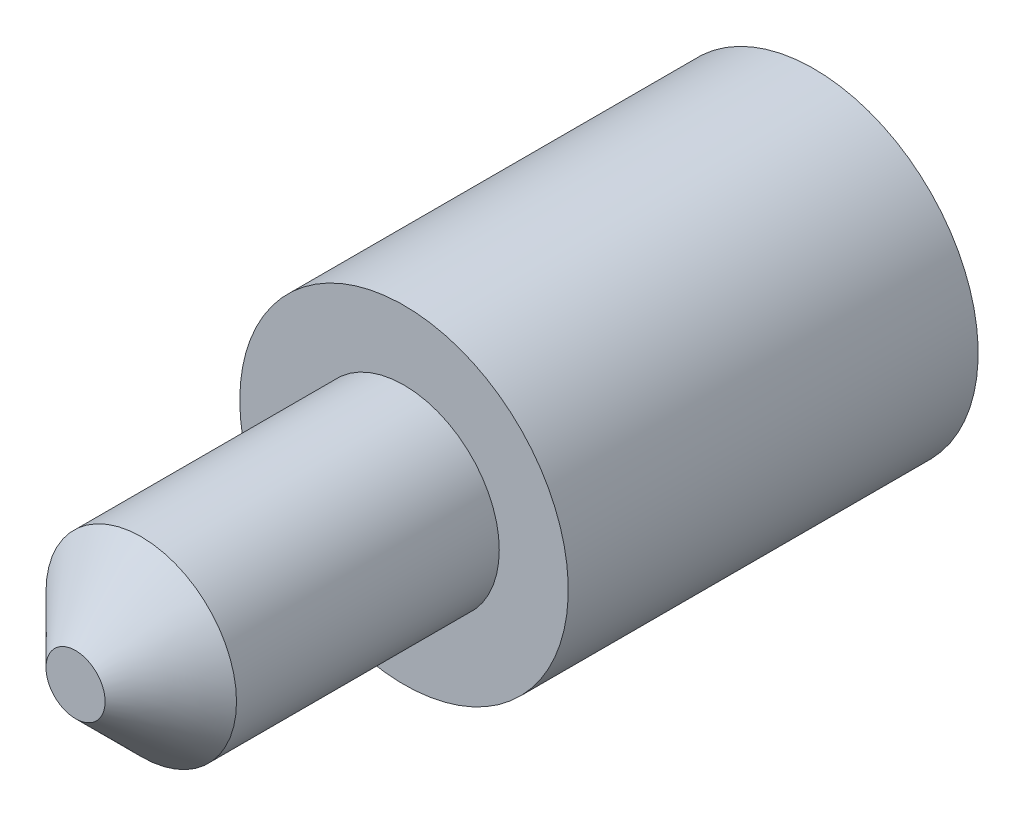
ISO-10303-21;
HEADER;
FILE_DESCRIPTION(('STEP AP214'),'2;1');
FILE_NAME('part.step','',(''),(''),'','','');
FILE_SCHEMA(('AUTOMOTIVE_DESIGN { 1 0 10303 214 1 1 1 1 }'));
ENDSEC;
DATA;
#1=APPLICATION_CONTEXT('core data for automotive mechanical design processes');
#2=APPLICATION_PROTOCOL_DEFINITION('international standard','automotive_design',2000,#1);
#3=PRODUCT_CONTEXT('',#1,'mechanical');
#4=PRODUCT('Part','Part','',(#3));
#5=PRODUCT_RELATED_PRODUCT_CATEGORY('part','',(#4));
#6=PRODUCT_DEFINITION_FORMATION('','',#4);
#7=PRODUCT_DEFINITION_CONTEXT('part definition',#1,'design');
#8=PRODUCT_DEFINITION('design','',#6,#7);
#9=PRODUCT_DEFINITION_SHAPE('','',#8);
#10=(LENGTH_UNIT() NAMED_UNIT(*) SI_UNIT(.MILLI.,.METRE.));
#11=(NAMED_UNIT(*) PLANE_ANGLE_UNIT() SI_UNIT($,.RADIAN.));
#12=(NAMED_UNIT(*) SI_UNIT($,.STERADIAN.) SOLID_ANGLE_UNIT());
#13=UNCERTAINTY_MEASURE_WITH_UNIT(LENGTH_MEASURE(1.E-05),#10,'distance_accuracy_value','');
#14=(GEOMETRIC_REPRESENTATION_CONTEXT(3) GLOBAL_UNCERTAINTY_ASSIGNED_CONTEXT((#13)) GLOBAL_UNIT_ASSIGNED_CONTEXT((#10,
#11,#12)) REPRESENTATION_CONTEXT('',''));
#15=CARTESIAN_POINT('',(0.,0.,0.));
#16=DIRECTION('',(0.,0.,1.));
#17=DIRECTION('',(1.,0.,0.));
#18=AXIS2_PLACEMENT_3D('',#15,#16,#17);
#19=CARTESIAN_POINT('',(0.,0.,6.24));
#20=DIRECTION('',(0.,0.,1.));
#21=DIRECTION('',(1.,0.,0.));
#22=AXIS2_PLACEMENT_3D('',#19,#20,#21);
#23=PLANE('',#22);
#24=CARTESIAN_POINT('',(0.,0.,6.24));
#25=DIRECTION('',(0.,0.,1.));
#26=DIRECTION('',(1.,0.,0.));
#27=AXIS2_PLACEMENT_3D('',#24,#25,#26);
#28=CIRCLE('',#27,2.5);
#29=CARTESIAN_POINT('',(-2.5,0.,6.24));
#30=VERTEX_POINT('',#29);
#31=EDGE_CURVE('E66',#30,#30,#28,.T.);
#32=ORIENTED_EDGE('',*,*,#31,.T.);
#33=EDGE_LOOP('',(#32));
#34=FACE_BOUND('',#33,.T.);
#35=CARTESIAN_POINT('',(0.,0.,6.24));
#36=DIRECTION('',(0.,0.,1.));
#37=DIRECTION('',(1.,0.,0.));
#38=AXIS2_PLACEMENT_3D('',#35,#36,#37);
#39=CIRCLE('',#38,1.45);
#40=CARTESIAN_POINT('',(1.45,0.,6.24));
#41=VERTEX_POINT('',#40);
#42=EDGE_CURVE('E57',#41,#41,#39,.T.);
#43=ORIENTED_EDGE('',*,*,#42,.F.);
#44=EDGE_LOOP('',(#43));
#45=FACE_BOUND('',#44,.T.);
#46=ADVANCED_FACE('F37',(#34,#45),#23,.T.);
#47=CARTESIAN_POINT('',(0.,0.,6.24));
#48=DIRECTION('',(0.,0.,-1.));
#49=DIRECTION('',(-1.,0.,0.));
#50=AXIS2_PLACEMENT_3D('',#47,#48,#49);
#51=CYLINDRICAL_SURFACE('',#50,2.5);
#52=CARTESIAN_POINT('',(0.,0.,0.));
#53=DIRECTION('',(0.,0.,1.));
#54=DIRECTION('',(1.,0.,0.));
#55=AXIS2_PLACEMENT_3D('',#52,#53,#54);
#56=CIRCLE('',#55,2.5);
#57=CARTESIAN_POINT('',(-2.5,0.,0.));
#58=VERTEX_POINT('',#57);
#59=EDGE_CURVE('E61',#58,#58,#56,.T.);
#60=CARTESIAN_POINT('',(-2.5,0.,6.24));
#61=CARTESIAN_POINT('',(-2.5,0.,6.175));
#62=CARTESIAN_POINT('',(-2.5,0.,6.11));
#63=CARTESIAN_POINT('',(-2.5,0.,5.98));
#64=CARTESIAN_POINT('',(-2.5,0.,5.915));
#65=CARTESIAN_POINT('',(-2.5,0.,5.785));
#66=CARTESIAN_POINT('',(-2.5,0.,5.72));
#67=CARTESIAN_POINT('',(-2.5,0.,5.59));
#68=CARTESIAN_POINT('',(-2.5,0.,5.525));
#69=CARTESIAN_POINT('',(-2.5,0.,5.395));
#70=CARTESIAN_POINT('',(-2.5,0.,5.33));
#71=CARTESIAN_POINT('',(-2.5,0.,5.2));
#72=CARTESIAN_POINT('',(-2.5,0.,5.135));
#73=CARTESIAN_POINT('',(-2.5,0.,5.005));
#74=CARTESIAN_POINT('',(-2.5,0.,4.94));
#75=CARTESIAN_POINT('',(-2.5,0.,4.81));
#76=CARTESIAN_POINT('',(-2.5,0.,4.745));
#77=CARTESIAN_POINT('',(-2.5,0.,4.615));
#78=CARTESIAN_POINT('',(-2.5,0.,4.55));
#79=CARTESIAN_POINT('',(-2.5,0.,4.42));
#80=CARTESIAN_POINT('',(-2.5,0.,4.355));
#81=CARTESIAN_POINT('',(-2.5,0.,4.225));
#82=CARTESIAN_POINT('',(-2.5,0.,4.16));
#83=CARTESIAN_POINT('',(-2.5,0.,4.03));
#84=CARTESIAN_POINT('',(-2.5,0.,3.965));
#85=CARTESIAN_POINT('',(-2.5,0.,3.835));
#86=CARTESIAN_POINT('',(-2.5,0.,3.77));
#87=CARTESIAN_POINT('',(-2.5,0.,3.64));
#88=CARTESIAN_POINT('',(-2.5,0.,3.575));
#89=CARTESIAN_POINT('',(-2.5,0.,3.445));
#90=CARTESIAN_POINT('',(-2.5,0.,3.38));
#91=CARTESIAN_POINT('',(-2.5,0.,3.25));
#92=CARTESIAN_POINT('',(-2.5,0.,3.185));
#93=CARTESIAN_POINT('',(-2.5,0.,3.055));
#94=CARTESIAN_POINT('',(-2.5,0.,2.99));
#95=CARTESIAN_POINT('',(-2.5,0.,2.86));
#96=CARTESIAN_POINT('',(-2.5,0.,2.795));
#97=CARTESIAN_POINT('',(-2.5,0.,2.665));
#98=CARTESIAN_POINT('',(-2.5,0.,2.6));
#99=CARTESIAN_POINT('',(-2.5,0.,2.47));
#100=CARTESIAN_POINT('',(-2.5,0.,2.405));
#101=CARTESIAN_POINT('',(-2.5,0.,2.275));
#102=CARTESIAN_POINT('',(-2.5,0.,2.21));
#103=CARTESIAN_POINT('',(-2.5,0.,2.08));
#104=CARTESIAN_POINT('',(-2.5,0.,2.015));
#105=CARTESIAN_POINT('',(-2.5,0.,1.885));
#106=CARTESIAN_POINT('',(-2.5,0.,1.82));
#107=CARTESIAN_POINT('',(-2.5,0.,1.69));
#108=CARTESIAN_POINT('',(-2.5,0.,1.625));
#109=CARTESIAN_POINT('',(-2.5,0.,1.495));
#110=CARTESIAN_POINT('',(-2.5,0.,1.43));
#111=CARTESIAN_POINT('',(-2.5,0.,1.3));
#112=CARTESIAN_POINT('',(-2.5,0.,1.235));
#113=CARTESIAN_POINT('',(-2.5,0.,1.105));
#114=CARTESIAN_POINT('',(-2.5,0.,1.04));
#115=CARTESIAN_POINT('',(-2.5,0.,0.91));
#116=CARTESIAN_POINT('',(-2.5,0.,0.845));
#117=CARTESIAN_POINT('',(-2.5,0.,0.715));
#118=CARTESIAN_POINT('',(-2.5,0.,0.65));
#119=CARTESIAN_POINT('',(-2.5,0.,0.52));
#120=CARTESIAN_POINT('',(-2.5,0.,0.455));
#121=CARTESIAN_POINT('',(-2.5,0.,0.325));
#122=CARTESIAN_POINT('',(-2.5,0.,0.26));
#123=CARTESIAN_POINT('',(-2.5,0.,0.13));
#124=CARTESIAN_POINT('',(-2.5,0.,0.0649999999999999));
#125=CARTESIAN_POINT('',(-2.5,0.,0.));
#126=B_SPLINE_CURVE_WITH_KNOTS('',3,(#60,#61,#62,#63,#64,#65,#66,#67,#68,#69,#70,#71,#72,#73,
#74,#75,#76,#77,#78,#79,#80,#81,#82,#83,#84,#85,#86,#87,#88,#89,#90,#91,#92,#93,#94,#95,#96,#97,
#98,#99,#100,#101,#102,#103,#104,#105,#106,#107,#108,#109,#110,#111,#112,#113,#114,#115,#116,
#117,#118,#119,#120,#121,#122,#123,#124,#125),.UNSPECIFIED.,.F.,.F.,(4,2,2,2,2,2,2,2,2,2,2,2,2,
2,2,2,2,2,2,2,2,2,2,2,2,2,2,2,2,2,2,2,4),(0.,0.195000000000001,0.390000000000001,0.585,0.78,
0.975,1.17,1.365,1.56,1.755,1.95,2.145,2.34,2.535,2.73,2.925,3.12,3.315,3.51,3.705,3.9,4.095,
4.29,4.485,4.68,4.875,5.07,5.265,5.46,5.655,5.85,6.045,6.24),.UNSPECIFIED.);
#127=EDGE_CURVE('BSEAM82',#30,#58,#126,.T.);
#128=ORIENTED_EDGE('',*,*,#31,.F.);
#129=ORIENTED_EDGE('',*,*,#59,.T.);
#130=ORIENTED_EDGE('',*,*,#127,.T.);
#131=ORIENTED_EDGE('',*,*,#127,.F.);
#132=EDGE_LOOP('',(#128,#130,#129,#131));
#133=FACE_BOUND('',#132,.T.);
#134=ADVANCED_FACE('F82',(#133),#51,.T.);
#135=CARTESIAN_POINT('',(0.,0.,0.));
#136=DIRECTION('',(0.,0.,1.));
#137=DIRECTION('',(1.,0.,0.));
#138=AXIS2_PLACEMENT_3D('',#135,#136,#137);
#139=PLANE('',#138);
#140=CARTESIAN_POINT('',(0.,0.,0.));
#141=DIRECTION('',(0.,0.,-1.));
#142=DIRECTION('',(-1.,0.,0.));
#143=AXIS2_PLACEMENT_3D('',#140,#141,#142);
#144=CIRCLE('',#143,1.24999999999999);
#145=CARTESIAN_POINT('',(-1.24999999999999,0.,0.));
#146=VERTEX_POINT('',#145);
#147=EDGE_CURVE('E58',#146,#146,#144,.T.);
#148=ORIENTED_EDGE('',*,*,#147,.F.);
#149=EDGE_LOOP('',(#148));
#150=FACE_BOUND('',#149,.T.);
#151=ORIENTED_EDGE('',*,*,#59,.F.);
#152=EDGE_LOOP('',(#151));
#153=FACE_BOUND('',#152,.T.);
#154=ADVANCED_FACE('F88',(#150,#153),#139,.F.);
#155=CARTESIAN_POINT('',(0.,0.,11.24));
#156=DIRECTION('',(0.,0.,-1.));
#157=DIRECTION('',(-1.,0.,0.));
#158=AXIS2_PLACEMENT_3D('',#155,#156,#157);
#159=CYLINDRICAL_SURFACE('',#158,1.45);
#160=CARTESIAN_POINT('',(0.,0.,10.24));
#161=DIRECTION('',(0.,0.,1.));
#162=DIRECTION('',(1.,0.,0.));
#163=AXIS2_PLACEMENT_3D('',#160,#161,#162);
#164=CIRCLE('',#163,1.45);
#165=CARTESIAN_POINT('',(-1.45,0.,10.24));
#166=VERTEX_POINT('',#165);
#167=EDGE_CURVE('E11',#166,#166,#164,.F.);
#168=ORIENTED_EDGE('',*,*,#167,.T.);
#169=EDGE_LOOP('',(#168));
#170=FACE_BOUND('',#169,.T.);
#171=ORIENTED_EDGE('',*,*,#42,.T.);
#172=EDGE_LOOP('',(#171));
#173=FACE_BOUND('',#172,.T.);
#174=ADVANCED_FACE('F93',(#170,#173),#159,.T.);
#175=CARTESIAN_POINT('',(0.,0.,11.24));
#176=DIRECTION('',(0.,0.,1.));
#177=DIRECTION('',(1.,0.,0.));
#178=AXIS2_PLACEMENT_3D('',#175,#176,#177);
#179=PLANE('',#178);
#180=CARTESIAN_POINT('',(0.,0.,11.24));
#181=DIRECTION('',(0.,0.,1.));
#182=DIRECTION('',(1.,0.,0.));
#183=AXIS2_PLACEMENT_3D('',#180,#181,#182);
#184=CIRCLE('',#183,0.449999999999999);
#185=CARTESIAN_POINT('',(-0.45,0.,11.24));
#186=VERTEX_POINT('',#185);
#187=EDGE_CURVE('E44',#186,#186,#184,.T.);
#188=ORIENTED_EDGE('',*,*,#187,.T.);
#189=EDGE_LOOP('',(#188));
#190=FACE_BOUND('',#189,.T.);
#191=ADVANCED_FACE('F51',(#190),#179,.T.);
#192=CARTESIAN_POINT('',(0.,0.,5.));
#193=DIRECTION('',(0.,0.,-1.));
#194=DIRECTION('',(-1.,0.,0.));
#195=AXIS2_PLACEMENT_3D('',#192,#193,#194);
#196=CONICAL_SURFACE('',#195,1.25,1.02974425867665);
#197=CARTESIAN_POINT('',(0.,0.,5.75107577378445));
#198=VERTEX_POINT('',#197);
#199=VERTEX_LOOP('',#198);
#200=FACE_BOUND('',#199,.T.);
#201=CARTESIAN_POINT('',(0.,0.,5.));
#202=DIRECTION('',(0.,0.,-1.));
#203=DIRECTION('',(-1.,0.,0.));
#204=AXIS2_PLACEMENT_3D('',#201,#202,#203);
#205=CIRCLE('',#204,1.25);
#206=CARTESIAN_POINT('',(-1.25,0.,5.));
#207=VERTEX_POINT('',#206);
#208=EDGE_CURVE('E55',#207,#207,#205,.T.);
#209=ORIENTED_EDGE('',*,*,#208,.T.);
#210=EDGE_LOOP('',(#209));
#211=FACE_BOUND('',#210,.T.);
#212=ADVANCED_FACE('F47',(#200,#211),#196,.F.);
#213=CARTESIAN_POINT('',(0.,0.,0.));
#214=DIRECTION('',(0.,0.,-1.));
#215=DIRECTION('',(-1.,0.,0.));
#216=AXIS2_PLACEMENT_3D('',#213,#214,#215);
#217=CYLINDRICAL_SURFACE('',#216,1.24999999999999);
#218=ORIENTED_EDGE('',*,*,#208,.F.);
#219=EDGE_LOOP('',(#218));
#220=FACE_BOUND('',#219,.T.);
#221=ORIENTED_EDGE('',*,*,#147,.T.);
#222=EDGE_LOOP('',(#221));
#223=FACE_BOUND('',#222,.T.);
#224=ADVANCED_FACE('F50',(#220,#223),#217,.F.);
#225=CARTESIAN_POINT('',(0.,0.,11.24));
#226=DIRECTION('',(0.,0.,-1.));
#227=DIRECTION('',(-1.,0.,0.));
#228=AXIS2_PLACEMENT_3D('',#225,#226,#227);
#229=CONICAL_SURFACE('',#228,0.449999999999999,0.785398163397447);
#230=CARTESIAN_POINT('',(-1.45,0.,10.24));
#231=CARTESIAN_POINT('',(-1.43958333333333,0.,10.2504166666667));
#232=CARTESIAN_POINT('',(-1.42916666666667,0.,10.2608333333333));
#233=CARTESIAN_POINT('',(-1.40833333333333,0.,10.2816666666667));
#234=CARTESIAN_POINT('',(-1.39791666666667,0.,10.2920833333333));
#235=CARTESIAN_POINT('',(-1.37708333333333,0.,10.3129166666667));
#236=CARTESIAN_POINT('',(-1.36666666666667,0.,10.3233333333333));
#237=CARTESIAN_POINT('',(-1.34583333333333,0.,10.3441666666667));
#238=CARTESIAN_POINT('',(-1.33541666666667,0.,10.3545833333333));
#239=CARTESIAN_POINT('',(-1.31458333333333,0.,10.3754166666667));
#240=CARTESIAN_POINT('',(-1.30416666666667,0.,10.3858333333333));
#241=CARTESIAN_POINT('',(-1.28333333333333,0.,10.4066666666667));
#242=CARTESIAN_POINT('',(-1.27291666666667,0.,10.4170833333333));
#243=CARTESIAN_POINT('',(-1.25208333333333,0.,10.4379166666667));
#244=CARTESIAN_POINT('',(-1.24166666666667,0.,10.4483333333333));
#245=CARTESIAN_POINT('',(-1.22083333333333,0.,10.4691666666667));
#246=CARTESIAN_POINT('',(-1.21041666666667,0.,10.4795833333333));
#247=CARTESIAN_POINT('',(-1.18958333333333,0.,10.5004166666667));
#248=CARTESIAN_POINT('',(-1.17916666666667,0.,10.5108333333333));
#249=CARTESIAN_POINT('',(-1.15833333333333,0.,10.5316666666667));
#250=CARTESIAN_POINT('',(-1.14791666666667,0.,10.5420833333333));
#251=CARTESIAN_POINT('',(-1.12708333333333,0.,10.5629166666667));
#252=CARTESIAN_POINT('',(-1.11666666666667,0.,10.5733333333333));
#253=CARTESIAN_POINT('',(-1.09583333333333,0.,10.5941666666667));
#254=CARTESIAN_POINT('',(-1.08541666666667,0.,10.6045833333333));
#255=CARTESIAN_POINT('',(-1.06458333333333,0.,10.6254166666667));
#256=CARTESIAN_POINT('',(-1.05416666666667,0.,10.6358333333333));
#257=CARTESIAN_POINT('',(-1.03333333333333,0.,10.6566666666667));
#258=CARTESIAN_POINT('',(-1.02291666666667,0.,10.6670833333333));
#259=CARTESIAN_POINT('',(-1.00208333333333,0.,10.6879166666667));
#260=CARTESIAN_POINT('',(-0.991666666666667,0.,10.6983333333333));
#261=CARTESIAN_POINT('',(-0.970833333333334,0.,10.7191666666667));
#262=CARTESIAN_POINT('',(-0.960416666666667,0.,10.7295833333333));
#263=CARTESIAN_POINT('',(-0.939583333333334,0.,10.7504166666667));
#264=CARTESIAN_POINT('',(-0.929166666666667,0.,10.7608333333333));
#265=CARTESIAN_POINT('',(-0.908333333333334,0.,10.7816666666667));
#266=CARTESIAN_POINT('',(-0.897916666666667,0.,10.7920833333333));
#267=CARTESIAN_POINT('',(-0.877083333333334,0.,10.8129166666667));
#268=CARTESIAN_POINT('',(-0.866666666666667,0.,10.8233333333333));
#269=CARTESIAN_POINT('',(-0.845833333333334,0.,10.8441666666667));
#270=CARTESIAN_POINT('',(-0.835416666666667,0.,10.8545833333333));
#271=CARTESIAN_POINT('',(-0.814583333333334,0.,10.8754166666667));
#272=CARTESIAN_POINT('',(-0.804166666666667,0.,10.8858333333333));
#273=CARTESIAN_POINT('',(-0.783333333333333,0.,10.9066666666667));
#274=CARTESIAN_POINT('',(-0.772916666666667,0.,10.9170833333333));
#275=CARTESIAN_POINT('',(-0.752083333333333,0.,10.9379166666667));
#276=CARTESIAN_POINT('',(-0.741666666666667,0.,10.9483333333333));
#277=CARTESIAN_POINT('',(-0.720833333333333,0.,10.9691666666667));
#278=CARTESIAN_POINT('',(-0.710416666666667,0.,10.9795833333333));
#279=CARTESIAN_POINT('',(-0.689583333333333,0.,11.0004166666667));
#280=CARTESIAN_POINT('',(-0.679166666666667,0.,11.0108333333333));
#281=CARTESIAN_POINT('',(-0.658333333333333,0.,11.0316666666667));
#282=CARTESIAN_POINT('',(-0.647916666666667,0.,11.0420833333333));
#283=CARTESIAN_POINT('',(-0.627083333333333,0.,11.0629166666667));
#284=CARTESIAN_POINT('',(-0.616666666666667,0.,11.0733333333333));
#285=CARTESIAN_POINT('',(-0.595833333333333,0.,11.0941666666667));
#286=CARTESIAN_POINT('',(-0.585416666666667,0.,11.1045833333333));
#287=CARTESIAN_POINT('',(-0.564583333333333,0.,11.1254166666667));
#288=CARTESIAN_POINT('',(-0.554166666666667,0.,11.1358333333333));
#289=CARTESIAN_POINT('',(-0.533333333333333,0.,11.1566666666667));
#290=CARTESIAN_POINT('',(-0.522916666666666,0.,11.1670833333333));
#291=CARTESIAN_POINT('',(-0.502083333333333,0.,11.1879166666667));
#292=CARTESIAN_POINT('',(-0.491666666666667,0.,11.1983333333333));
#293=CARTESIAN_POINT('',(-0.470833333333333,0.,11.2191666666667));
#294=CARTESIAN_POINT('',(-0.460416666666667,0.,11.2295833333333));
#295=CARTESIAN_POINT('',(-0.45,0.,11.24));
#296=B_SPLINE_CURVE_WITH_KNOTS('',3,(#230,#231,#232,#233,#234,#235,#236,#237,#238,#239,#240,
#241,#242,#243,#244,#245,#246,#247,#248,#249,#250,#251,#252,#253,#254,#255,#256,#257,#258,#259,
#260,#261,#262,#263,#264,#265,#266,#267,#268,#269,#270,#271,#272,#273,#274,#275,#276,#277,#278,
#279,#280,#281,#282,#283,#284,#285,#286,#287,#288,#289,#290,#291,#292,#293,#294,#295),
.UNSPECIFIED.,.F.,.F.,(4,2,2,2,2,2,2,2,2,2,2,2,2,2,2,2,2,2,2,2,2,2,2,2,2,2,2,2,2,2,2,2,4),(0.,
0.0441941738241593,0.0883883476483198,0.132582521472479,0.176776695296638,0.220970869120798,
0.265165042944957,0.309359216769116,0.353553390593275,0.397747564417435,0.441941738241594,
0.486135912065753,0.530330085889912,0.574524259714072,0.618718433538231,0.66291260736239,
0.70710678118655,0.751300955010709,0.795495128834868,0.839689302659027,0.883883476483187,
0.928077650307346,0.972271824131505,1.01646599795566,1.06066017177982,1.10485434560398,
1.14904851942814,1.1932426932523,1.23743686707646,1.28163104090062,1.32582521472478,
1.37001938854894,1.4142135623731),.UNSPECIFIED.);
#297=EDGE_CURVE('BSEAM39',#166,#186,#296,.T.);
#298=ORIENTED_EDGE('',*,*,#167,.F.);
#299=ORIENTED_EDGE('',*,*,#187,.F.);
#300=ORIENTED_EDGE('',*,*,#297,.T.);
#301=ORIENTED_EDGE('',*,*,#297,.F.);
#302=EDGE_LOOP('',(#298,#300,#299,#301));
#303=FACE_BOUND('',#302,.T.);
#304=ADVANCED_FACE('F39',(#303),#229,.T.);
#305=CLOSED_SHELL('',(#46,#134,#154,#174,#191,#212,#224,#304));
#306=MANIFOLD_SOLID_BREP('B2',#305);
#307=ADVANCED_BREP_SHAPE_REPRESENTATION('',(#18,#306),#14);
#308=SHAPE_DEFINITION_REPRESENTATION(#9,#307);
ENDSEC;
END-ISO-10303-21;
